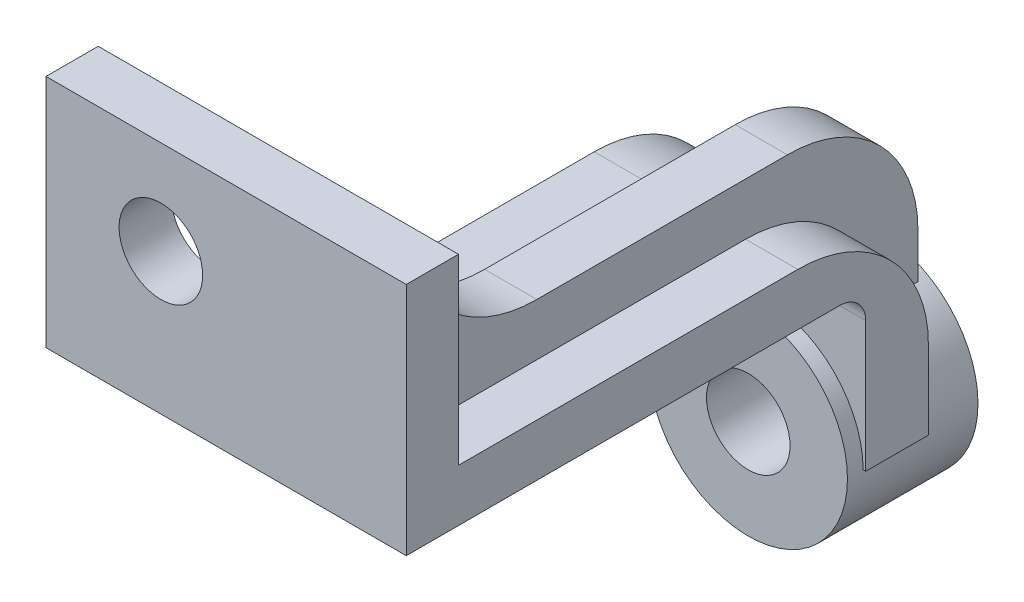
ISO-10303-21;
HEADER;
FILE_DESCRIPTION(('STEP AP214'),'2;1');
FILE_NAME('part.step','',(''),(''),'','','');
FILE_SCHEMA(('AUTOMOTIVE_DESIGN { 1 0 10303 214 1 1 1 1 }'));
ENDSEC;
DATA;
#1=APPLICATION_CONTEXT('core data for automotive mechanical design processes');
#2=APPLICATION_PROTOCOL_DEFINITION('international standard','automotive_design',2000,#1);
#3=PRODUCT_CONTEXT('',#1,'mechanical');
#4=PRODUCT('Part','Part','',(#3));
#5=PRODUCT_RELATED_PRODUCT_CATEGORY('part','',(#4));
#6=PRODUCT_DEFINITION_FORMATION('','',#4);
#7=PRODUCT_DEFINITION_CONTEXT('part definition',#1,'design');
#8=PRODUCT_DEFINITION('design','',#6,#7);
#9=PRODUCT_DEFINITION_SHAPE('','',#8);
#10=(LENGTH_UNIT() NAMED_UNIT(*) SI_UNIT(.MILLI.,.METRE.));
#11=(NAMED_UNIT(*) PLANE_ANGLE_UNIT() SI_UNIT($,.RADIAN.));
#12=(NAMED_UNIT(*) SI_UNIT($,.STERADIAN.) SOLID_ANGLE_UNIT());
#13=UNCERTAINTY_MEASURE_WITH_UNIT(LENGTH_MEASURE(1.E-05),#10,'distance_accuracy_value','');
#14=(GEOMETRIC_REPRESENTATION_CONTEXT(3) GLOBAL_UNCERTAINTY_ASSIGNED_CONTEXT((#13)) GLOBAL_UNIT_ASSIGNED_CONTEXT((#10,
#11,#12)) REPRESENTATION_CONTEXT('',''));
#15=CARTESIAN_POINT('',(0.,0.,0.));
#16=DIRECTION('',(0.,0.,1.));
#17=DIRECTION('',(1.,0.,0.));
#18=AXIS2_PLACEMENT_3D('',#15,#16,#17);
#19=CARTESIAN_POINT('',(0.,0.,0.));
#20=DIRECTION('',(0.,0.,1.));
#21=DIRECTION('',(1.,0.,0.));
#22=AXIS2_PLACEMENT_3D('',#19,#20,#21);
#23=PLANE('',#22);
#24=CARTESIAN_POINT('',(-12.5,4.5,0.));
#25=DIRECTION('',(0.,0.,1.));
#26=DIRECTION('',(1.,0.,0.));
#27=AXIS2_PLACEMENT_3D('',#24,#25,#26);
#28=CIRCLE('',#27,8.);
#29=CARTESIAN_POINT('',(-4.50000000000002,4.5,0.));
#30=VERTEX_POINT('',#29);
#31=EDGE_CURVE('E325',#30,#30,#28,.T.);
#32=ORIENTED_EDGE('',*,*,#31,.T.);
#33=EDGE_LOOP('',(#32));
#34=FACE_BOUND('',#33,.T.);
#35=DIRECTION('',(0.,-1.,0.));
#36=VECTOR('',#35,1.);
#37=CARTESIAN_POINT('',(14.5,22.5,0.));
#38=LINE('',#37,#36);
#39=CARTESIAN_POINT('',(14.5,22.5,0.));
#40=VERTEX_POINT('',#39);
#41=CARTESIAN_POINT('',(14.5,-12.5,0.));
#42=VERTEX_POINT('',#41);
#43=EDGE_CURVE('E199',#40,#42,#38,.T.);
#44=ORIENTED_EDGE('',*,*,#43,.T.);
#45=DIRECTION('',(1.,0.,0.));
#46=VECTOR('',#45,1.);
#47=CARTESIAN_POINT('',(-132.988578017961,-12.5,0.));
#48=LINE('',#47,#46);
#49=CARTESIAN_POINT('',(-34.5,-12.5,0.));
#50=VERTEX_POINT('',#49);
#51=EDGE_CURVE('E322',#50,#42,#48,.T.);
#52=ORIENTED_EDGE('',*,*,#51,.F.);
#53=DIRECTION('',(0.,-1.,0.));
#54=VECTOR('',#53,1.);
#55=CARTESIAN_POINT('',(-34.5,-22.5,0.));
#56=LINE('',#55,#54);
#57=CARTESIAN_POINT('',(-34.5,22.5,0.));
#58=VERTEX_POINT('',#57);
#59=EDGE_CURVE('E227',#58,#50,#56,.T.);
#60=ORIENTED_EDGE('',*,*,#59,.F.);
#61=DIRECTION('',(-1.,0.,0.));
#62=VECTOR('',#61,1.);
#63=CARTESIAN_POINT('',(34.5,22.5,0.));
#64=LINE('',#63,#62);
#65=EDGE_CURVE('E225',#40,#58,#64,.T.);
#66=ORIENTED_EDGE('',*,*,#65,.F.);
#67=EDGE_LOOP('',(#44,#52,#60,#66));
#68=FACE_BOUND('',#67,.T.);
#69=ADVANCED_FACE('F46',(#34,#68),#23,.F.);
#70=CARTESIAN_POINT('',(-132.988578017961,-12.5,0.));
#71=DIRECTION('',(0.,1.,0.));
#72=DIRECTION('',(0.,0.,1.));
#73=AXIS2_PLACEMENT_3D('',#70,#71,#72);
#74=PLANE('',#73);
#75=DIRECTION('',(0.,0.,-1.));
#76=VECTOR('',#75,1.);
#77=CARTESIAN_POINT('',(14.5,-12.5,0.));
#78=LINE('',#77,#76);
#79=CARTESIAN_POINT('',(14.5,-12.5,-65.));
#80=VERTEX_POINT('',#79);
#81=EDGE_CURVE('E205',#42,#80,#78,.T.);
#82=ORIENTED_EDGE('',*,*,#81,.T.);
#83=DIRECTION('',(1.,0.,0.));
#84=VECTOR('',#83,1.);
#85=CARTESIAN_POINT('',(-132.988578017961,-12.5,-65.));
#86=LINE('',#85,#84);
#87=CARTESIAN_POINT('',(-4.50000000000002,-12.5,-65.));
#88=VERTEX_POINT('',#87);
#89=EDGE_CURVE('E423',#80,#88,#86,.F.);
#90=ORIENTED_EDGE('',*,*,#89,.T.);
#91=DIRECTION('',(0.,0.,-1.));
#92=VECTOR('',#91,1.);
#93=CARTESIAN_POINT('',(-4.50000000000002,-12.5,0.));
#94=LINE('',#93,#92);
#95=CARTESIAN_POINT('',(-4.50000000000002,-12.5,-30.));
#96=VERTEX_POINT('',#95);
#97=EDGE_CURVE('E276',#96,#88,#94,.T.);
#98=ORIENTED_EDGE('',*,*,#97,.F.);
#99=CARTESIAN_POINT('',(-34.5,-12.5,-30.));
#100=DIRECTION('',(0.,1.,0.));
#101=DIRECTION('',(0.,0.,1.));
#102=AXIS2_PLACEMENT_3D('',#99,#100,#101);
#103=CIRCLE('',#102,30.);
#104=EDGE_CURVE('E269',#50,#96,#103,.T.);
#105=ORIENTED_EDGE('',*,*,#104,.F.);
#106=ORIENTED_EDGE('',*,*,#51,.T.);
#107=EDGE_LOOP('',(#82,#90,#98,#105,#106));
#108=FACE_BOUND('',#107,.T.);
#109=ADVANCED_FACE('F506',(#108),#74,.T.);
#110=CARTESIAN_POINT('',(-132.988578017961,-12.5,-90.));
#111=DIRECTION('',(0.,0.,-1.));
#112=DIRECTION('',(-1.,0.,0.));
#113=AXIS2_PLACEMENT_3D('',#110,#111,#112);
#114=PLANE('',#113);
#115=DIRECTION('',(0.,1.,0.));
#116=VECTOR('',#115,1.);
#117=CARTESIAN_POINT('',(-4.50000000000002,-69.5,-90.));
#118=LINE('',#117,#116);
#119=CARTESIAN_POINT('',(-4.50000000000002,-52.5,-90.));
#120=VERTEX_POINT('',#119);
#121=CARTESIAN_POINT('',(-4.50000000000002,-37.5,-90.));
#122=VERTEX_POINT('',#121);
#123=EDGE_CURVE('E281',#120,#122,#118,.T.);
#124=ORIENTED_EDGE('',*,*,#123,.T.);
#125=DIRECTION('',(1.,0.,0.));
#126=VECTOR('',#125,1.);
#127=CARTESIAN_POINT('',(-132.988578017961,-37.5,-90.));
#128=LINE('',#127,#126);
#129=CARTESIAN_POINT('',(3.33809621030937,-37.5,-90.));
#130=VERTEX_POINT('',#129);
#131=EDGE_CURVE('E419',#122,#130,#128,.T.);
#132=ORIENTED_EDGE('',*,*,#131,.T.);
#133=CARTESIAN_POINT('',(15.,-52.5,-90.));
#134=DIRECTION('',(0.,0.,-1.));
#135=DIRECTION('',(-1.,0.,0.));
#136=AXIS2_PLACEMENT_3D('',#133,#134,#135);
#137=CIRCLE('',#136,19.);
#138=CARTESIAN_POINT('',(-4.00000000000001,-52.5,-90.));
#139=VERTEX_POINT('',#138);
#140=EDGE_CURVE('E270',#139,#130,#137,.T.);
#141=ORIENTED_EDGE('',*,*,#140,.F.);
#142=DIRECTION('',(1.,0.,0.));
#143=VECTOR('',#142,1.);
#144=CARTESIAN_POINT('',(-132.988578017961,-52.5,-90.));
#145=LINE('',#144,#143);
#146=EDGE_CURVE('E327',#120,#139,#145,.T.);
#147=ORIENTED_EDGE('',*,*,#146,.F.);
#148=EDGE_LOOP('',(#124,#132,#141,#147));
#149=FACE_BOUND('',#148,.T.);
#150=ADVANCED_FACE('F502',(#149),#114,.T.);
#151=CARTESIAN_POINT('',(15.,-52.5,-100.));
#152=DIRECTION('',(0.,0.,1.));
#153=DIRECTION('',(1.,0.,0.));
#154=AXIS2_PLACEMENT_3D('',#151,#152,#153);
#155=CYLINDRICAL_SURFACE('',#154,19.);
#156=CARTESIAN_POINT('',(15.,-52.5,-75.));
#157=DIRECTION('',(0.,0.,1.));
#158=DIRECTION('',(1.,0.,0.));
#159=AXIS2_PLACEMENT_3D('',#156,#157,#158);
#160=CIRCLE('',#159,19.);
#161=CARTESIAN_POINT('',(34.,-52.5,-75.));
#162=VERTEX_POINT('',#161);
#163=EDGE_CURVE('E257',#162,#162,#160,.T.);
#164=ORIENTED_EDGE('',*,*,#163,.F.);
#165=EDGE_LOOP('',(#164));
#166=FACE_BOUND('',#165,.T.);
#167=CARTESIAN_POINT('',(15.,-52.5,-100.));
#168=DIRECTION('',(0.,0.,-1.));
#169=DIRECTION('',(-1.,0.,0.));
#170=AXIS2_PLACEMENT_3D('',#167,#168,#169);
#171=CIRCLE('',#170,19.);
#172=CARTESIAN_POINT('',(-4.00000000000001,-52.5,-100.));
#173=VERTEX_POINT('',#172);
#174=EDGE_CURVE('E265',#173,#173,#171,.T.);
#175=ORIENTED_EDGE('',*,*,#174,.F.);
#176=EDGE_LOOP('',(#175));
#177=FACE_BOUND('',#176,.T.);
#178=DIRECTION('',(0.,0.,1.));
#179=VECTOR('',#178,1.);
#180=CARTESIAN_POINT('',(14.5,-33.5065800867774,-100.));
#181=LINE('',#180,#179);
#182=CARTESIAN_POINT('',(14.5,-33.5065800867774,-98.));
#183=VERTEX_POINT('',#182);
#184=CARTESIAN_POINT('',(14.5,-33.5065800867774,-89.6789910125328));
#185=VERTEX_POINT('',#184);
#186=EDGE_CURVE('E62',#183,#185,#181,.T.);
#187=ORIENTED_EDGE('',*,*,#186,.F.);
#188=CARTESIAN_POINT('',(15.,-52.5,-98.));
#189=DIRECTION('',(0.,0.,-1.));
#190=DIRECTION('',(0.,1.,0.));
#191=AXIS2_PLACEMENT_3D('',#188,#189,#190);
#192=CIRCLE('',#191,19.);
#193=CARTESIAN_POINT('',(24.5,-36.0455173280956,-98.));
#194=VERTEX_POINT('',#193);
#195=EDGE_CURVE('E391',#183,#194,#192,.T.);
#196=ORIENTED_EDGE('',*,*,#195,.T.);
#197=DIRECTION('',(0.,0.,1.));
#198=VECTOR('',#197,1.);
#199=CARTESIAN_POINT('',(24.5,-36.0455173280956,-100.));
#200=LINE('',#199,#198);
#201=CARTESIAN_POINT('',(24.5,-36.0455173280956,-89.9576537390262));
#202=VERTEX_POINT('',#201);
#203=EDGE_CURVE('E70',#194,#202,#200,.T.);
#204=ORIENTED_EDGE('',*,*,#203,.T.);
#205=CARTESIAN_POINT('',(24.5,-36.0455173280956,-89.9576537390262));
#206=CARTESIAN_POINT('',(24.688260103272,-36.1542076260871,-89.9639867908858));
#207=CARTESIAN_POINT('',(24.8746678536981,-36.2661397676233,-89.9697987485582));
#208=CARTESIAN_POINT('',(25.2433318579762,-36.4962100744206,-89.9801053730138));
#209=CARTESIAN_POINT('',(25.4255929305536,-36.6143404467563,-89.9846016492966));
#210=CARTESIAN_POINT('',(25.7859812524392,-36.8567978440195,-89.9920187033648));
#211=CARTESIAN_POINT('',(25.9641084824726,-36.9811248978317,-89.9949394738055));
#212=CARTESIAN_POINT('',(26.316225926707,-37.235978897808,-89.9989308858274));
#213=CARTESIAN_POINT('',(26.4902107828114,-37.3665132818464,-89.9999992472994));
#214=CARTESIAN_POINT('',(26.6619037896906,-37.5,-90.));
#215=B_SPLINE_CURVE_WITH_KNOTS('',3,(#205,#206,#207,#208,#209,#210,#211,#212,#213,#214),
.UNSPECIFIED.,.F.,.F.,(4,2,2,2,4),(0.,0.652395849523336,1.30399024122591,1.95558767050201,
2.60798657578599),.UNSPECIFIED.);
#216=CARTESIAN_POINT('',(26.6619037896906,-37.5,-90.));
#217=VERTEX_POINT('',#216);
#218=EDGE_CURVE('E432',#202,#217,#215,.T.);
#219=ORIENTED_EDGE('',*,*,#218,.T.);
#220=CARTESIAN_POINT('',(34.,-52.5,-90.));
#221=VERTEX_POINT('',#220);
#222=EDGE_CURVE('E261',#217,#221,#137,.T.);
#223=ORIENTED_EDGE('',*,*,#222,.T.);
#224=DIRECTION('',(0.,0.,1.));
#225=VECTOR('',#224,1.);
#226=CARTESIAN_POINT('',(34.,-52.5,-90.));
#227=LINE('',#226,#225);
#228=CARTESIAN_POINT('',(34.,-52.5,-78.));
#229=VERTEX_POINT('',#228);
#230=EDGE_CURVE('E250',#221,#229,#227,.T.);
#231=ORIENTED_EDGE('',*,*,#230,.T.);
#232=CARTESIAN_POINT('',(15.,-52.5,-78.));
#233=DIRECTION('',(0.,0.,1.));
#234=DIRECTION('',(1.,0.,0.));
#235=AXIS2_PLACEMENT_3D('',#232,#233,#234);
#236=CIRCLE('',#235,19.);
#237=CARTESIAN_POINT('',(-4.,-52.5,-78.));
#238=VERTEX_POINT('',#237);
#239=EDGE_CURVE('E254',#229,#238,#236,.T.);
#240=ORIENTED_EDGE('',*,*,#239,.T.);
#241=DIRECTION('',(0.,0.,1.));
#242=VECTOR('',#241,1.);
#243=CARTESIAN_POINT('',(-4.00000000000001,-52.5,-90.));
#244=LINE('',#243,#242);
#245=EDGE_CURVE('E244',#139,#238,#244,.T.);
#246=ORIENTED_EDGE('',*,*,#245,.F.);
#247=ORIENTED_EDGE('',*,*,#140,.T.);
#248=CARTESIAN_POINT('',(3.33809621030937,-37.5,-90.));
#249=CARTESIAN_POINT('',(3.55122625910662,-37.3342996557761,-89.9999980746272));
#250=CARTESIAN_POINT('',(3.76785653722548,-37.1731677112262,-89.9983528321975));
#251=CARTESIAN_POINT('',(4.20775024757038,-36.8603002985606,-89.9923044540649));
#252=CARTESIAN_POINT('',(4.43101341663091,-36.7085644583813,-89.9879014276407));
#253=CARTESIAN_POINT('',(5.11005320044708,-36.2679342666726,-89.9713527323119));
#254=CARTESIAN_POINT('',(5.57524435869576,-35.9934895764741,-89.9558666330679));
#255=CARTESIAN_POINT('',(6.51469336345593,-35.4918888694809,-89.9204551765284));
#256=CARTESIAN_POINT('',(6.98840243492971,-35.2636902909615,-89.9006554832317));
#257=CARTESIAN_POINT('',(7.95304335277275,-34.8473437591928,-89.8597505842154));
#258=CARTESIAN_POINT('',(8.44397381246241,-34.659192589878,-89.8386454835042));
#259=CARTESIAN_POINT('',(9.38398085020888,-34.3429635673598,-89.8003133388736));
#260=CARTESIAN_POINT('',(9.83158752537844,-34.2105178537253,-89.7829166863226));
#261=CARTESIAN_POINT('',(10.7353926084709,-33.9789111617533,-89.7510728853015));
#262=CARTESIAN_POINT('',(11.1915902387844,-33.8797471860705,-89.7366254712697));
#263=CARTESIAN_POINT('',(12.1210601704366,-33.7133086234351,-89.711702951455));
#264=CARTESIAN_POINT('',(12.5944813199858,-33.646842103951,-89.7013296702811));
#265=CARTESIAN_POINT('',(13.3073766910797,-33.5740348055405,-89.6898228375526));
#266=CARTESIAN_POINT('',(13.5455164998965,-33.5542465329863,-89.6866625173824));
#267=CARTESIAN_POINT('',(14.0223888761872,-33.5236633909093,-89.6817533861861));
#268=CARTESIAN_POINT('',(14.2611214473902,-33.5128685781099,-89.6800045840626));
#269=CARTESIAN_POINT('',(14.5,-33.5065800867774,-89.6789910125328));
#270=B_SPLINE_CURVE_WITH_KNOTS('',3,(#248,#249,#250,#251,#252,#253,#254,#255,#256,#257,#258,
#259,#260,#261,#262,#263,#264,#265,#266,#267,#268,#269),.UNSPECIFIED.,.F.,.F.,(4,2,2,2,2,2,2,2,
2,2,4),(0.,0.809750532230498,1.61946897972422,3.23828387208236,4.8150791329249,6.39174771911302,
7.79184549036464,9.19181713529667,10.6248375867046,11.3416316302352,12.0584301946772),.UNSPECIFIED.);
#271=EDGE_CURVE('E56',#130,#185,#270,.T.);
#272=ORIENTED_EDGE('',*,*,#271,.T.);
#273=EDGE_LOOP('',(#187,#196,#204,#219,#223,#231,#240,#246,#247,#272));
#274=FACE_BOUND('',#273,.T.);
#275=ADVANCED_FACE('F443',(#166,#177,#274),#155,.T.);
#276=CARTESIAN_POINT('',(-132.988578017961,-52.5,-90.));
#277=DIRECTION('',(0.,-1.,0.));
#278=DIRECTION('',(0.,0.,-1.));
#279=AXIS2_PLACEMENT_3D('',#276,#277,#278);
#280=PLANE('',#279);
#281=ORIENTED_EDGE('',*,*,#146,.T.);
#282=ORIENTED_EDGE('',*,*,#245,.T.);
#283=DIRECTION('',(1.,0.,0.));
#284=VECTOR('',#283,1.);
#285=CARTESIAN_POINT('',(-132.988578017961,-52.5,-78.));
#286=LINE('',#285,#284);
#287=CARTESIAN_POINT('',(-4.5,-52.5,-78.));
#288=VERTEX_POINT('',#287);
#289=EDGE_CURVE('E332',#288,#238,#286,.T.);
#290=ORIENTED_EDGE('',*,*,#289,.F.);
#291=DIRECTION('',(0.,0.,1.));
#292=VECTOR('',#291,1.);
#293=CARTESIAN_POINT('',(-4.5,-52.5,-90.));
#294=LINE('',#293,#292);
#295=EDGE_CURVE('E291',#120,#288,#294,.T.);
#296=ORIENTED_EDGE('',*,*,#295,.F.);
#297=EDGE_LOOP('',(#281,#282,#290,#296));
#298=FACE_BOUND('',#297,.T.);
#299=ADVANCED_FACE('F482',(#298),#280,.T.);
#300=CARTESIAN_POINT('',(24.5,-12.5,0.));
#301=VERTEX_POINT('',#300);
#302=CARTESIAN_POINT('',(34.5,-12.5,0.));
#303=VERTEX_POINT('',#302);
#304=EDGE_CURVE('E326',#301,#303,#48,.T.);
#305=ORIENTED_EDGE('',*,*,#304,.F.);
#306=DIRECTION('',(0.,-1.,0.));
#307=VECTOR('',#306,1.);
#308=CARTESIAN_POINT('',(24.5,22.5,0.));
#309=LINE('',#308,#307);
#310=CARTESIAN_POINT('',(24.5,22.5,0.));
#311=VERTEX_POINT('',#310);
#312=EDGE_CURVE('E564',#311,#301,#309,.T.);
#313=ORIENTED_EDGE('',*,*,#312,.F.);
#314=CARTESIAN_POINT('',(34.5,22.5,0.));
#315=VERTEX_POINT('',#314);
#316=EDGE_CURVE('E232',#315,#311,#64,.T.);
#317=ORIENTED_EDGE('',*,*,#316,.F.);
#318=DIRECTION('',(0.,1.,0.));
#319=VECTOR('',#318,1.);
#320=CARTESIAN_POINT('',(34.5,-22.5,0.));
#321=LINE('',#320,#319);
#322=EDGE_CURVE('E233',#303,#315,#321,.T.);
#323=ORIENTED_EDGE('',*,*,#322,.F.);
#324=EDGE_LOOP('',(#305,#313,#317,#323));
#325=FACE_BOUND('',#324,.T.);
#326=ADVANCED_FACE('F479',(#325),#23,.F.);
#327=CARTESIAN_POINT('',(0.,0.,10.));
#328=DIRECTION('',(0.,0.,1.));
#329=DIRECTION('',(1.,0.,0.));
#330=AXIS2_PLACEMENT_3D('',#327,#328,#329);
#331=PLANE('',#330);
#332=DIRECTION('',(0.,-1.,0.));
#333=VECTOR('',#332,1.);
#334=CARTESIAN_POINT('',(-34.5,-22.5,10.));
#335=LINE('',#334,#333);
#336=CARTESIAN_POINT('',(-34.5,22.5,10.));
#337=VERTEX_POINT('',#336);
#338=CARTESIAN_POINT('',(-34.5,-22.5,10.));
#339=VERTEX_POINT('',#338);
#340=EDGE_CURVE('E343',#337,#339,#335,.T.);
#341=ORIENTED_EDGE('',*,*,#340,.T.);
#342=DIRECTION('',(1.,0.,0.));
#343=VECTOR('',#342,1.);
#344=CARTESIAN_POINT('',(34.5,-22.5,10.));
#345=LINE('',#344,#343);
#346=CARTESIAN_POINT('',(34.5,-22.5,10.));
#347=VERTEX_POINT('',#346);
#348=EDGE_CURVE('E347',#339,#347,#345,.T.);
#349=ORIENTED_EDGE('',*,*,#348,.T.);
#350=DIRECTION('',(0.,1.,0.));
#351=VECTOR('',#350,1.);
#352=CARTESIAN_POINT('',(34.5,-22.5,10.));
#353=LINE('',#352,#351);
#354=CARTESIAN_POINT('',(34.5,22.5,10.));
#355=VERTEX_POINT('',#354);
#356=EDGE_CURVE('E350',#347,#355,#353,.T.);
#357=ORIENTED_EDGE('',*,*,#356,.T.);
#358=DIRECTION('',(-1.,0.,0.));
#359=VECTOR('',#358,1.);
#360=CARTESIAN_POINT('',(34.5,22.5,10.));
#361=LINE('',#360,#359);
#362=EDGE_CURVE('E353',#355,#337,#361,.T.);
#363=ORIENTED_EDGE('',*,*,#362,.T.);
#364=EDGE_LOOP('',(#341,#349,#357,#363));
#365=FACE_BOUND('',#364,.T.);
#366=CARTESIAN_POINT('',(-12.5,4.5,10.));
#367=DIRECTION('',(0.,0.,1.));
#368=DIRECTION('',(1.,0.,0.));
#369=AXIS2_PLACEMENT_3D('',#366,#367,#368);
#370=CIRCLE('',#369,8.);
#371=CARTESIAN_POINT('',(-4.50000000000002,4.5,10.));
#372=VERTEX_POINT('',#371);
#373=EDGE_CURVE('E336',#372,#372,#370,.T.);
#374=ORIENTED_EDGE('',*,*,#373,.F.);
#375=EDGE_LOOP('',(#374));
#376=FACE_BOUND('',#375,.T.);
#377=ADVANCED_FACE('F467',(#365,#376),#331,.T.);
#378=CARTESIAN_POINT('',(-34.5,-22.5,10.));
#379=DIRECTION('',(1.,0.,0.));
#380=DIRECTION('',(0.,0.,-1.));
#381=AXIS2_PLACEMENT_3D('',#378,#379,#380);
#382=PLANE('',#381);
#383=ORIENTED_EDGE('',*,*,#59,.T.);
#384=DIRECTION('',(0.,1.,0.));
#385=VECTOR('',#384,1.);
#386=CARTESIAN_POINT('',(-34.5,-69.5,0.));
#387=LINE('',#386,#385);
#388=CARTESIAN_POINT('',(-34.5,-22.5,0.));
#389=VERTEX_POINT('',#388);
#390=EDGE_CURVE('E302',#50,#389,#387,.F.);
#391=ORIENTED_EDGE('',*,*,#390,.T.);
#392=DIRECTION('',(0.,0.,-1.));
#393=VECTOR('',#392,1.);
#394=CARTESIAN_POINT('',(-34.5,-22.5,10.));
#395=LINE('',#394,#393);
#396=EDGE_CURVE('E371',#339,#389,#395,.T.);
#397=ORIENTED_EDGE('',*,*,#396,.F.);
#398=ORIENTED_EDGE('',*,*,#340,.F.);
#399=DIRECTION('',(0.,0.,-1.));
#400=VECTOR('',#399,1.);
#401=CARTESIAN_POINT('',(-34.5,22.5,10.));
#402=LINE('',#401,#400);
#403=EDGE_CURVE('E356',#337,#58,#402,.T.);
#404=ORIENTED_EDGE('',*,*,#403,.T.);
#405=EDGE_LOOP('',(#383,#391,#397,#398,#404));
#406=FACE_BOUND('',#405,.T.);
#407=ADVANCED_FACE('F463',(#406),#382,.F.);
#408=CARTESIAN_POINT('',(34.5,-22.5,10.));
#409=DIRECTION('',(0.,1.,0.));
#410=DIRECTION('',(-1.,0.,0.));
#411=AXIS2_PLACEMENT_3D('',#408,#409,#410);
#412=PLANE('',#411);
#413=CARTESIAN_POINT('',(-34.5,-22.5,-30.));
#414=DIRECTION('',(0.,1.,0.));
#415=DIRECTION('',(-1.,0.,0.));
#416=AXIS2_PLACEMENT_3D('',#413,#414,#415);
#417=CIRCLE('',#416,30.);
#418=CARTESIAN_POINT('',(-4.50000000000002,-22.5,-30.));
#419=VERTEX_POINT('',#418);
#420=EDGE_CURVE('E298',#389,#419,#417,.T.);
#421=ORIENTED_EDGE('',*,*,#420,.T.);
#422=DIRECTION('',(0.,0.,-1.));
#423=VECTOR('',#422,1.);
#424=CARTESIAN_POINT('',(-4.50000000000002,-22.5,10.));
#425=LINE('',#424,#423);
#426=CARTESIAN_POINT('',(-4.50000000000002,-22.5,-73.));
#427=VERTEX_POINT('',#426);
#428=EDGE_CURVE('E294',#419,#427,#425,.T.);
#429=ORIENTED_EDGE('',*,*,#428,.T.);
#430=DIRECTION('',(1.,0.,0.));
#431=VECTOR('',#430,1.);
#432=CARTESIAN_POINT('',(34.5,-22.5,-73.));
#433=LINE('',#432,#431);
#434=CARTESIAN_POINT('',(34.5,-22.5,-73.));
#435=VERTEX_POINT('',#434);
#436=EDGE_CURVE('E375',#427,#435,#433,.T.);
#437=ORIENTED_EDGE('',*,*,#436,.T.);
#438=DIRECTION('',(0.,0.,-1.));
#439=VECTOR('',#438,1.);
#440=CARTESIAN_POINT('',(34.5,-22.5,10.));
#441=LINE('',#440,#439);
#442=EDGE_CURVE('E367',#347,#435,#441,.T.);
#443=ORIENTED_EDGE('',*,*,#442,.F.);
#444=ORIENTED_EDGE('',*,*,#348,.F.);
#445=ORIENTED_EDGE('',*,*,#396,.T.);
#446=EDGE_LOOP('',(#421,#429,#437,#443,#444,#445));
#447=FACE_BOUND('',#446,.T.);
#448=ADVANCED_FACE('F466',(#447),#412,.F.);
#449=CARTESIAN_POINT('',(34.5,-22.5,10.));
#450=DIRECTION('',(-1.,0.,0.));
#451=DIRECTION('',(0.,0.,1.));
#452=AXIS2_PLACEMENT_3D('',#449,#450,#451);
#453=PLANE('',#452);
#454=DIRECTION('',(0.,1.,0.));
#455=VECTOR('',#454,1.);
#456=CARTESIAN_POINT('',(34.5,-12.5,-90.));
#457=LINE('',#456,#455);
#458=CARTESIAN_POINT('',(34.5,-52.5,-90.));
#459=VERTEX_POINT('',#458);
#460=CARTESIAN_POINT('',(34.5,-37.5,-90.));
#461=VERTEX_POINT('',#460);
#462=EDGE_CURVE('E314',#459,#461,#457,.T.);
#463=ORIENTED_EDGE('',*,*,#462,.T.);
#464=CARTESIAN_POINT('',(34.5,-37.5,-65.));
#465=DIRECTION('',(-1.,0.,0.));
#466=DIRECTION('',(0.,0.,1.));
#467=AXIS2_PLACEMENT_3D('',#464,#465,#466);
#468=CIRCLE('',#467,25.);
#469=CARTESIAN_POINT('',(34.5,-12.5,-65.));
#470=VERTEX_POINT('',#469);
#471=EDGE_CURVE('E413',#461,#470,#468,.F.);
#472=ORIENTED_EDGE('',*,*,#471,.T.);
#473=DIRECTION('',(0.,0.,1.));
#474=VECTOR('',#473,1.);
#475=CARTESIAN_POINT('',(34.5,-12.5,0.));
#476=LINE('',#475,#474);
#477=EDGE_CURVE('E318',#470,#303,#476,.T.);
#478=ORIENTED_EDGE('',*,*,#477,.T.);
#479=ORIENTED_EDGE('',*,*,#322,.T.);
#480=DIRECTION('',(0.,0.,-1.));
#481=VECTOR('',#480,1.);
#482=CARTESIAN_POINT('',(34.5,22.5,10.));
#483=LINE('',#482,#481);
#484=EDGE_CURVE('E364',#355,#315,#483,.T.);
#485=ORIENTED_EDGE('',*,*,#484,.F.);
#486=ORIENTED_EDGE('',*,*,#356,.F.);
#487=ORIENTED_EDGE('',*,*,#442,.T.);
#488=CARTESIAN_POINT('',(34.5,-27.5,-73.));
#489=DIRECTION('',(-1.,0.,0.));
#490=DIRECTION('',(0.,0.,1.));
#491=AXIS2_PLACEMENT_3D('',#488,#489,#490);
#492=CIRCLE('',#491,5.);
#493=CARTESIAN_POINT('',(34.5,-27.5,-78.));
#494=VERTEX_POINT('',#493);
#495=EDGE_CURVE('E382',#435,#494,#492,.T.);
#496=ORIENTED_EDGE('',*,*,#495,.T.);
#497=DIRECTION('',(0.,-1.,0.));
#498=VECTOR('',#497,1.);
#499=CARTESIAN_POINT('',(34.5,-52.5,-78.));
#500=LINE('',#499,#498);
#501=CARTESIAN_POINT('',(34.5,-52.5,-78.));
#502=VERTEX_POINT('',#501);
#503=EDGE_CURVE('E306',#494,#502,#500,.T.);
#504=ORIENTED_EDGE('',*,*,#503,.T.);
#505=DIRECTION('',(0.,0.,-1.));
#506=VECTOR('',#505,1.);
#507=CARTESIAN_POINT('',(34.5,-52.5,-90.));
#508=LINE('',#507,#506);
#509=EDGE_CURVE('E310',#502,#459,#508,.T.);
#510=ORIENTED_EDGE('',*,*,#509,.T.);
#511=EDGE_LOOP('',(#463,#472,#478,#479,#485,#486,#487,#496,#504,#510));
#512=FACE_BOUND('',#511,.T.);
#513=ADVANCED_FACE('F471',(#512),#453,.F.);
#514=CARTESIAN_POINT('',(34.5,22.5,10.));
#515=DIRECTION('',(0.,-1.,0.));
#516=DIRECTION('',(1.,0.,0.));
#517=AXIS2_PLACEMENT_3D('',#514,#515,#516);
#518=PLANE('',#517);
#519=ORIENTED_EDGE('',*,*,#316,.T.);
#520=DIRECTION('',(1.,0.,0.));
#521=VECTOR('',#520,1.);
#522=CARTESIAN_POINT('',(14.5,22.5,0.));
#523=LINE('',#522,#521);
#524=EDGE_CURVE('E217',#40,#311,#523,.T.);
#525=ORIENTED_EDGE('',*,*,#524,.F.);
#526=ORIENTED_EDGE('',*,*,#65,.T.);
#527=ORIENTED_EDGE('',*,*,#403,.F.);
#528=ORIENTED_EDGE('',*,*,#362,.F.);
#529=ORIENTED_EDGE('',*,*,#484,.T.);
#530=EDGE_LOOP('',(#519,#525,#526,#527,#528,#529));
#531=FACE_BOUND('',#530,.T.);
#532=ADVANCED_FACE('F236',(#531),#518,.F.);
#533=CARTESIAN_POINT('',(-12.5,4.5,10.));
#534=DIRECTION('',(0.,0.,-1.));
#535=DIRECTION('',(-1.,0.,0.));
#536=AXIS2_PLACEMENT_3D('',#533,#534,#535);
#537=CYLINDRICAL_SURFACE('',#536,8.);
#538=ORIENTED_EDGE('',*,*,#373,.T.);
#539=EDGE_LOOP('',(#538));
#540=FACE_BOUND('',#539,.T.);
#541=ORIENTED_EDGE('',*,*,#31,.F.);
#542=EDGE_LOOP('',(#541));
#543=FACE_BOUND('',#542,.T.);
#544=ADVANCED_FACE('F478',(#540,#543),#537,.F.);
#545=ORIENTED_EDGE('',*,*,#477,.F.);
#546=DIRECTION('',(1.,0.,0.));
#547=VECTOR('',#546,1.);
#548=CARTESIAN_POINT('',(-132.988578017961,-12.5,-65.));
#549=LINE('',#548,#547);
#550=CARTESIAN_POINT('',(24.5,-12.5,-65.));
#551=VERTEX_POINT('',#550);
#552=EDGE_CURVE('E416',#470,#551,#549,.F.);
#553=ORIENTED_EDGE('',*,*,#552,.T.);
#554=DIRECTION('',(0.,0.,-1.));
#555=VECTOR('',#554,1.);
#556=CARTESIAN_POINT('',(24.5,-12.5,0.));
#557=LINE('',#556,#555);
#558=EDGE_CURVE('E569',#301,#551,#557,.T.);
#559=ORIENTED_EDGE('',*,*,#558,.F.);
#560=ORIENTED_EDGE('',*,*,#304,.T.);
#561=EDGE_LOOP('',(#545,#553,#559,#560));
#562=FACE_BOUND('',#561,.T.);
#563=ADVANCED_FACE('F489',(#562),#74,.T.);
#564=ORIENTED_EDGE('',*,*,#222,.F.);
#565=DIRECTION('',(1.,0.,0.));
#566=VECTOR('',#565,1.);
#567=CARTESIAN_POINT('',(-132.988578017961,-37.5,-90.));
#568=LINE('',#567,#566);
#569=EDGE_CURVE('E409',#217,#461,#568,.T.);
#570=ORIENTED_EDGE('',*,*,#569,.T.);
#571=ORIENTED_EDGE('',*,*,#462,.F.);
#572=EDGE_CURVE('E331',#221,#459,#145,.T.);
#573=ORIENTED_EDGE('',*,*,#572,.F.);
#574=EDGE_LOOP('',(#564,#570,#571,#573));
#575=FACE_BOUND('',#574,.T.);
#576=ADVANCED_FACE('F497',(#575),#114,.T.);
#577=ORIENTED_EDGE('',*,*,#230,.F.);
#578=ORIENTED_EDGE('',*,*,#572,.T.);
#579=ORIENTED_EDGE('',*,*,#509,.F.);
#580=EDGE_CURVE('E321',#229,#502,#286,.T.);
#581=ORIENTED_EDGE('',*,*,#580,.F.);
#582=EDGE_LOOP('',(#577,#578,#579,#581));
#583=FACE_BOUND('',#582,.T.);
#584=ADVANCED_FACE('F493',(#583),#280,.T.);
#585=CARTESIAN_POINT('',(-132.988578017961,-52.5,-78.));
#586=DIRECTION('',(0.,0.,1.));
#587=DIRECTION('',(1.,0.,0.));
#588=AXIS2_PLACEMENT_3D('',#585,#586,#587);
#589=PLANE('',#588);
#590=ORIENTED_EDGE('',*,*,#289,.T.);
#591=ORIENTED_EDGE('',*,*,#239,.F.);
#592=ORIENTED_EDGE('',*,*,#580,.T.);
#593=ORIENTED_EDGE('',*,*,#503,.F.);
#594=DIRECTION('',(1.,0.,0.));
#595=VECTOR('',#594,1.);
#596=CARTESIAN_POINT('',(-132.988578017961,-27.5,-78.));
#597=LINE('',#596,#595);
#598=CARTESIAN_POINT('',(-4.5,-27.5,-78.));
#599=VERTEX_POINT('',#598);
#600=EDGE_CURVE('E378',#494,#599,#597,.F.);
#601=ORIENTED_EDGE('',*,*,#600,.T.);
#602=DIRECTION('',(0.,1.,0.));
#603=VECTOR('',#602,1.);
#604=CARTESIAN_POINT('',(-4.5,-52.5,-78.));
#605=LINE('',#604,#603);
#606=EDGE_CURVE('E285',#288,#599,#605,.T.);
#607=ORIENTED_EDGE('',*,*,#606,.F.);
#608=EDGE_LOOP('',(#590,#591,#592,#593,#601,#607));
#609=FACE_BOUND('',#608,.T.);
#610=ADVANCED_FACE('F461',(#609),#589,.T.);
#611=CARTESIAN_POINT('',(34.5,-27.5,-73.));
#612=DIRECTION('',(1.,0.,0.));
#613=DIRECTION('',(0.,1.,0.));
#614=AXIS2_PLACEMENT_3D('',#611,#612,#613);
#615=CYLINDRICAL_SURFACE('',#614,5.);
#616=ORIENTED_EDGE('',*,*,#436,.F.);
#617=CARTESIAN_POINT('',(-4.50000000000002,-27.5,-73.));
#618=DIRECTION('',(1.,0.,0.));
#619=DIRECTION('',(0.,0.,-1.));
#620=AXIS2_PLACEMENT_3D('',#617,#618,#619);
#621=CIRCLE('',#620,5.);
#622=EDGE_CURVE('E385',#427,#599,#621,.F.);
#623=ORIENTED_EDGE('',*,*,#622,.T.);
#624=ORIENTED_EDGE('',*,*,#600,.F.);
#625=ORIENTED_EDGE('',*,*,#495,.F.);
#626=EDGE_LOOP('',(#616,#623,#624,#625));
#627=FACE_BOUND('',#626,.T.);
#628=ADVANCED_FACE('F457',(#627),#615,.F.);
#629=CARTESIAN_POINT('',(-34.5,-69.5,-30.));
#630=DIRECTION('',(0.,1.,0.));
#631=DIRECTION('',(0.,0.,1.));
#632=AXIS2_PLACEMENT_3D('',#629,#630,#631);
#633=CYLINDRICAL_SURFACE('',#632,30.);
#634=ORIENTED_EDGE('',*,*,#104,.T.);
#635=DIRECTION('',(0.,1.,0.));
#636=VECTOR('',#635,1.);
#637=CARTESIAN_POINT('',(-4.50000000000002,-69.5,-30.));
#638=LINE('',#637,#636);
#639=EDGE_CURVE('E280',#419,#96,#638,.T.);
#640=ORIENTED_EDGE('',*,*,#639,.F.);
#641=ORIENTED_EDGE('',*,*,#420,.F.);
#642=ORIENTED_EDGE('',*,*,#390,.F.);
#643=EDGE_LOOP('',(#634,#640,#641,#642));
#644=FACE_BOUND('',#643,.T.);
#645=ADVANCED_FACE('F460',(#644),#633,.F.);
#646=CARTESIAN_POINT('',(-4.50000000000002,-69.5,0.));
#647=DIRECTION('',(1.,0.,0.));
#648=DIRECTION('',(0.,0.,-1.));
#649=AXIS2_PLACEMENT_3D('',#646,#647,#648);
#650=PLANE('',#649);
#651=ORIENTED_EDGE('',*,*,#97,.T.);
#652=CARTESIAN_POINT('',(-4.5,-37.5,-65.));
#653=DIRECTION('',(1.,0.,0.));
#654=DIRECTION('',(0.,0.,-1.));
#655=AXIS2_PLACEMENT_3D('',#652,#653,#654);
#656=CIRCLE('',#655,25.);
#657=EDGE_CURVE('E426',#88,#122,#656,.F.);
#658=ORIENTED_EDGE('',*,*,#657,.T.);
#659=ORIENTED_EDGE('',*,*,#123,.F.);
#660=ORIENTED_EDGE('',*,*,#295,.T.);
#661=ORIENTED_EDGE('',*,*,#606,.T.);
#662=ORIENTED_EDGE('',*,*,#622,.F.);
#663=ORIENTED_EDGE('',*,*,#428,.F.);
#664=ORIENTED_EDGE('',*,*,#639,.T.);
#665=EDGE_LOOP('',(#651,#658,#659,#660,#661,#662,#663,#664));
#666=FACE_BOUND('',#665,.T.);
#667=ADVANCED_FACE('F508',(#666),#650,.F.);
#668=CARTESIAN_POINT('',(15.,-52.5,-100.));
#669=DIRECTION('',(0.,0.,-1.));
#670=DIRECTION('',(-1.,0.,0.));
#671=AXIS2_PLACEMENT_3D('',#668,#669,#670);
#672=PLANE('',#671);
#673=CARTESIAN_POINT('',(15.,-52.5,-100.));
#674=DIRECTION('',(0.,0.,-1.));
#675=DIRECTION('',(-1.,0.,0.));
#676=AXIS2_PLACEMENT_3D('',#673,#674,#675);
#677=CIRCLE('',#676,8.);
#678=CARTESIAN_POINT('',(6.99999999999999,-52.5,-100.));
#679=VERTEX_POINT('',#678);
#680=EDGE_CURVE('E576',#679,#679,#677,.T.);
#681=ORIENTED_EDGE('',*,*,#680,.F.);
#682=EDGE_LOOP('',(#681));
#683=FACE_BOUND('',#682,.T.);
#684=ORIENTED_EDGE('',*,*,#174,.T.);
#685=EDGE_LOOP('',(#684));
#686=FACE_BOUND('',#685,.T.);
#687=ADVANCED_FACE('F511',(#683,#686),#672,.T.);
#688=CARTESIAN_POINT('',(15.,-52.5,-75.));
#689=DIRECTION('',(0.,0.,1.));
#690=DIRECTION('',(1.,0.,0.));
#691=AXIS2_PLACEMENT_3D('',#688,#689,#690);
#692=PLANE('',#691);
#693=CARTESIAN_POINT('',(15.,-52.5,-75.));
#694=DIRECTION('',(0.,0.,1.));
#695=DIRECTION('',(1.,0.,0.));
#696=AXIS2_PLACEMENT_3D('',#693,#694,#695);
#697=CIRCLE('',#696,8.);
#698=CARTESIAN_POINT('',(23.,-52.5,-75.));
#699=VERTEX_POINT('',#698);
#700=EDGE_CURVE('E608',#699,#699,#697,.F.);
#701=ORIENTED_EDGE('',*,*,#700,.T.);
#702=EDGE_LOOP('',(#701));
#703=FACE_BOUND('',#702,.T.);
#704=ORIENTED_EDGE('',*,*,#163,.T.);
#705=EDGE_LOOP('',(#704));
#706=FACE_BOUND('',#705,.T.);
#707=ADVANCED_FACE('F516',(#703,#706),#692,.T.);
#708=CARTESIAN_POINT('',(14.5,22.5,-25.));
#709=DIRECTION('',(1.,0.,0.));
#710=DIRECTION('',(0.,0.,-1.));
#711=AXIS2_PLACEMENT_3D('',#708,#709,#710);
#712=PLANE('',#711);
#713=DIRECTION('',(0.,0.,1.));
#714=VECTOR('',#713,1.);
#715=CARTESIAN_POINT('',(14.5,-2.49999999999999,-25.));
#716=LINE('',#715,#714);
#717=CARTESIAN_POINT('',(14.5,-2.49999999999999,-73.));
#718=VERTEX_POINT('',#717);
#719=CARTESIAN_POINT('',(14.5,-2.49999999999999,-25.));
#720=VERTEX_POINT('',#719);
#721=EDGE_CURVE('E240',#718,#720,#716,.T.);
#722=ORIENTED_EDGE('',*,*,#721,.F.);
#723=CARTESIAN_POINT('',(14.5,-27.5,-73.));
#724=DIRECTION('',(1.,0.,0.));
#725=DIRECTION('',(0.,0.,-1.));
#726=AXIS2_PLACEMENT_3D('',#723,#724,#725);
#727=CIRCLE('',#726,25.);
#728=CARTESIAN_POINT('',(14.5,-27.5,-98.));
#729=VERTEX_POINT('',#728);
#730=EDGE_CURVE('E406',#718,#729,#727,.F.);
#731=ORIENTED_EDGE('',*,*,#730,.T.);
#732=DIRECTION('',(0.,1.,0.));
#733=VECTOR('',#732,1.);
#734=CARTESIAN_POINT('',(14.5,-46.9373007355784,-98.));
#735=LINE('',#734,#733);
#736=EDGE_CURVE('E246',#183,#729,#735,.T.);
#737=ORIENTED_EDGE('',*,*,#736,.F.);
#738=ORIENTED_EDGE('',*,*,#186,.T.);
#739=CARTESIAN_POINT('',(14.5,-37.5,-65.));
#740=DIRECTION('',(1.,0.,0.));
#741=DIRECTION('',(0.,0.,-1.));
#742=AXIS2_PLACEMENT_3D('',#739,#740,#741);
#743=CIRCLE('',#742,25.);
#744=EDGE_CURVE('E12',#185,#80,#743,.T.);
#745=ORIENTED_EDGE('',*,*,#744,.T.);
#746=ORIENTED_EDGE('',*,*,#81,.F.);
#747=ORIENTED_EDGE('',*,*,#43,.F.);
#748=CARTESIAN_POINT('',(14.5,22.5,-25.));
#749=DIRECTION('',(-1.,0.,0.));
#750=DIRECTION('',(0.,0.,-1.));
#751=AXIS2_PLACEMENT_3D('',#748,#749,#750);
#752=CIRCLE('',#751,25.);
#753=EDGE_CURVE('E203',#720,#40,#752,.T.);
#754=ORIENTED_EDGE('',*,*,#753,.F.);
#755=EDGE_LOOP('',(#722,#731,#737,#738,#745,#746,#747,#754));
#756=FACE_BOUND('',#755,.T.);
#757=ADVANCED_FACE('F202',(#756),#712,.F.);
#758=CARTESIAN_POINT('',(24.5,22.5,-25.));
#759=DIRECTION('',(1.,0.,0.));
#760=DIRECTION('',(0.,0.,-1.));
#761=AXIS2_PLACEMENT_3D('',#758,#759,#760);
#762=PLANE('',#761);
#763=DIRECTION('',(0.,1.,0.));
#764=VECTOR('',#763,1.);
#765=CARTESIAN_POINT('',(24.5,-2.49999999999999,-98.));
#766=LINE('',#765,#764);
#767=CARTESIAN_POINT('',(24.5,-27.5,-98.));
#768=VERTEX_POINT('',#767);
#769=EDGE_CURVE('E574',#194,#768,#766,.T.);
#770=ORIENTED_EDGE('',*,*,#769,.T.);
#771=CARTESIAN_POINT('',(24.5,-27.5,-73.));
#772=DIRECTION('',(1.,0.,0.));
#773=DIRECTION('',(0.,0.,-1.));
#774=AXIS2_PLACEMENT_3D('',#771,#772,#773);
#775=CIRCLE('',#774,25.);
#776=CARTESIAN_POINT('',(24.5,-2.49999999999999,-73.));
#777=VERTEX_POINT('',#776);
#778=EDGE_CURVE('E400',#768,#777,#775,.T.);
#779=ORIENTED_EDGE('',*,*,#778,.T.);
#780=DIRECTION('',(0.,0.,1.));
#781=VECTOR('',#780,1.);
#782=CARTESIAN_POINT('',(24.5,-2.49999999999999,-25.));
#783=LINE('',#782,#781);
#784=CARTESIAN_POINT('',(24.5,-2.49999999999999,-25.));
#785=VERTEX_POINT('',#784);
#786=EDGE_CURVE('E222',#777,#785,#783,.T.);
#787=ORIENTED_EDGE('',*,*,#786,.T.);
#788=CARTESIAN_POINT('',(24.5,22.5,-25.));
#789=DIRECTION('',(-1.,0.,0.));
#790=DIRECTION('',(0.,0.,-1.));
#791=AXIS2_PLACEMENT_3D('',#788,#789,#790);
#792=CIRCLE('',#791,25.);
#793=EDGE_CURVE('E570',#785,#311,#792,.T.);
#794=ORIENTED_EDGE('',*,*,#793,.T.);
#795=ORIENTED_EDGE('',*,*,#312,.T.);
#796=ORIENTED_EDGE('',*,*,#558,.T.);
#797=CARTESIAN_POINT('',(24.5,-37.5,-65.));
#798=DIRECTION('',(1.,0.,0.));
#799=DIRECTION('',(0.,0.,-1.));
#800=AXIS2_PLACEMENT_3D('',#797,#798,#799);
#801=CIRCLE('',#800,25.);
#802=EDGE_CURVE('E429',#551,#202,#801,.F.);
#803=ORIENTED_EDGE('',*,*,#802,.T.);
#804=ORIENTED_EDGE('',*,*,#203,.F.);
#805=EDGE_LOOP('',(#770,#779,#787,#794,#795,#796,#803,#804));
#806=FACE_BOUND('',#805,.T.);
#807=ADVANCED_FACE('F583',(#806),#762,.T.);
#808=CARTESIAN_POINT('',(14.5,22.5,-25.));
#809=DIRECTION('',(1.,0.,0.));
#810=DIRECTION('',(0.,0.,-1.));
#811=AXIS2_PLACEMENT_3D('',#808,#809,#810);
#812=CYLINDRICAL_SURFACE('',#811,25.);
#813=ORIENTED_EDGE('',*,*,#793,.F.);
#814=DIRECTION('',(1.,0.,0.));
#815=VECTOR('',#814,1.);
#816=CARTESIAN_POINT('',(14.5,-2.49999999999999,-25.));
#817=LINE('',#816,#815);
#818=EDGE_CURVE('E220',#720,#785,#817,.T.);
#819=ORIENTED_EDGE('',*,*,#818,.F.);
#820=ORIENTED_EDGE('',*,*,#753,.T.);
#821=ORIENTED_EDGE('',*,*,#524,.T.);
#822=EDGE_LOOP('',(#813,#819,#820,#821));
#823=FACE_BOUND('',#822,.T.);
#824=ADVANCED_FACE('F215',(#823),#812,.F.);
#825=CARTESIAN_POINT('',(14.5,-2.49999999999999,-25.));
#826=DIRECTION('',(0.,1.,0.));
#827=DIRECTION('',(0.,0.,1.));
#828=AXIS2_PLACEMENT_3D('',#825,#826,#827);
#829=PLANE('',#828);
#830=ORIENTED_EDGE('',*,*,#786,.F.);
#831=DIRECTION('',(1.,0.,0.));
#832=VECTOR('',#831,1.);
#833=CARTESIAN_POINT('',(14.5,-2.49999999999999,-73.));
#834=LINE('',#833,#832);
#835=EDGE_CURVE('E403',#777,#718,#834,.F.);
#836=ORIENTED_EDGE('',*,*,#835,.T.);
#837=ORIENTED_EDGE('',*,*,#721,.T.);
#838=ORIENTED_EDGE('',*,*,#818,.T.);
#839=EDGE_LOOP('',(#830,#836,#837,#838));
#840=FACE_BOUND('',#839,.T.);
#841=ADVANCED_FACE('F586',(#840),#829,.T.);
#842=CARTESIAN_POINT('',(14.5,-2.49999999999999,-98.));
#843=DIRECTION('',(0.,0.,-1.));
#844=DIRECTION('',(0.,1.,0.));
#845=AXIS2_PLACEMENT_3D('',#842,#843,#844);
#846=PLANE('',#845);
#847=ORIENTED_EDGE('',*,*,#736,.T.);
#848=DIRECTION('',(1.,0.,0.));
#849=VECTOR('',#848,1.);
#850=CARTESIAN_POINT('',(14.5,-27.5,-98.));
#851=LINE('',#850,#849);
#852=EDGE_CURVE('E396',#729,#768,#851,.T.);
#853=ORIENTED_EDGE('',*,*,#852,.T.);
#854=ORIENTED_EDGE('',*,*,#769,.F.);
#855=ORIENTED_EDGE('',*,*,#195,.F.);
#856=EDGE_LOOP('',(#847,#853,#854,#855));
#857=FACE_BOUND('',#856,.T.);
#858=ADVANCED_FACE('F592',(#857),#846,.T.);
#859=CARTESIAN_POINT('',(15.,-52.5,10.001));
#860=DIRECTION('',(0.,0.,-1.));
#861=DIRECTION('',(-1.,0.,0.));
#862=AXIS2_PLACEMENT_3D('',#859,#860,#861);
#863=CYLINDRICAL_SURFACE('',#862,8.);
#864=ORIENTED_EDGE('',*,*,#700,.F.);
#865=EDGE_LOOP('',(#864));
#866=FACE_BOUND('',#865,.T.);
#867=ORIENTED_EDGE('',*,*,#680,.T.);
#868=EDGE_LOOP('',(#867));
#869=FACE_BOUND('',#868,.T.);
#870=ADVANCED_FACE('F455',(#866,#869),#863,.F.);
#871=CARTESIAN_POINT('',(14.5,-27.5,-73.));
#872=DIRECTION('',(1.,0.,0.));
#873=DIRECTION('',(0.,0.,-1.));
#874=AXIS2_PLACEMENT_3D('',#871,#872,#873);
#875=CYLINDRICAL_SURFACE('',#874,25.);
#876=ORIENTED_EDGE('',*,*,#730,.F.);
#877=ORIENTED_EDGE('',*,*,#835,.F.);
#878=ORIENTED_EDGE('',*,*,#778,.F.);
#879=ORIENTED_EDGE('',*,*,#852,.F.);
#880=EDGE_LOOP('',(#876,#877,#878,#879));
#881=FACE_BOUND('',#880,.T.);
#882=ADVANCED_FACE('F451',(#881),#875,.T.);
#883=CARTESIAN_POINT('',(-132.988578017961,-37.5,-65.));
#884=DIRECTION('',(1.,0.,0.));
#885=DIRECTION('',(0.,0.,-1.));
#886=AXIS2_PLACEMENT_3D('',#883,#884,#885);
#887=CYLINDRICAL_SURFACE('',#886,25.);
#888=ORIENTED_EDGE('',*,*,#802,.F.);
#889=ORIENTED_EDGE('',*,*,#552,.F.);
#890=ORIENTED_EDGE('',*,*,#471,.F.);
#891=ORIENTED_EDGE('',*,*,#569,.F.);
#892=ORIENTED_EDGE('',*,*,#218,.F.);
#893=EDGE_LOOP('',(#888,#889,#890,#891,#892));
#894=FACE_BOUND('',#893,.T.);
#895=ADVANCED_FACE('F447',(#894),#887,.T.);
#896=CARTESIAN_POINT('',(-132.988578017961,-37.5,-65.));
#897=DIRECTION('',(1.,0.,0.));
#898=DIRECTION('',(0.,0.,-1.));
#899=AXIS2_PLACEMENT_3D('',#896,#897,#898);
#900=CYLINDRICAL_SURFACE('',#899,25.);
#901=ORIENTED_EDGE('',*,*,#657,.F.);
#902=ORIENTED_EDGE('',*,*,#89,.F.);
#903=ORIENTED_EDGE('',*,*,#744,.F.);
#904=ORIENTED_EDGE('',*,*,#271,.F.);
#905=ORIENTED_EDGE('',*,*,#131,.F.);
#906=EDGE_LOOP('',(#901,#902,#903,#904,#905));
#907=FACE_BOUND('',#906,.T.);
#908=ADVANCED_FACE('F48',(#907),#900,.T.);
#909=CLOSED_SHELL('',(#69,#109,#150,#275,#299,#326,#377,#407,#448,#513,#532,#544,#563,#576,#584,
#610,#628,#645,#667,#687,#707,#757,#807,#824,#841,#858,#870,#882,#895,#908));
#910=MANIFOLD_SOLID_BREP('B2',#909);
#911=ADVANCED_BREP_SHAPE_REPRESENTATION('',(#18,#910),#14);
#912=SHAPE_DEFINITION_REPRESENTATION(#9,#911);
ENDSEC;
END-ISO-10303-21;
